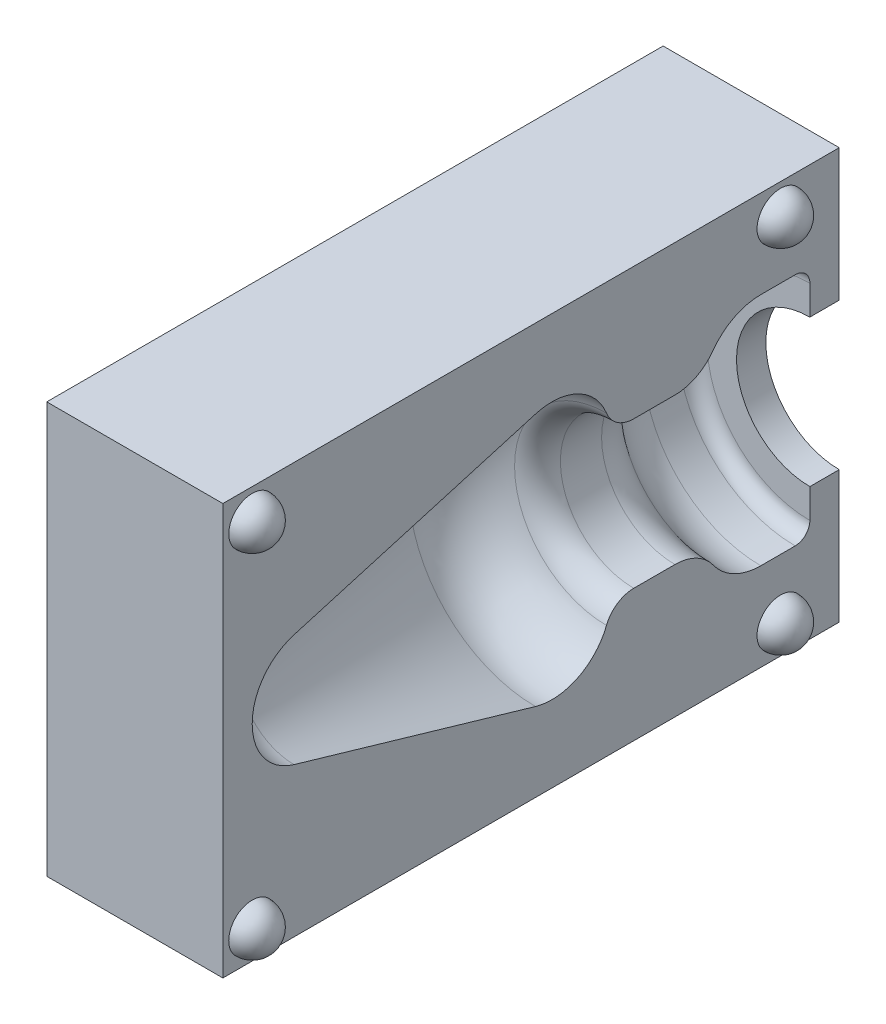
ISO-10303-21;
HEADER;
FILE_DESCRIPTION(('STEP AP214'),'2;1');
FILE_NAME('part.step','',(''),(''),'','','');
FILE_SCHEMA(('AUTOMOTIVE_DESIGN { 1 0 10303 214 1 1 1 1 }'));
ENDSEC;
DATA;
#1=APPLICATION_CONTEXT('core data for automotive mechanical design processes');
#2=APPLICATION_PROTOCOL_DEFINITION('international standard','automotive_design',2000,#1);
#3=PRODUCT_CONTEXT('',#1,'mechanical');
#4=PRODUCT('Part','Part','',(#3));
#5=PRODUCT_RELATED_PRODUCT_CATEGORY('part','',(#4));
#6=PRODUCT_DEFINITION_FORMATION('','',#4);
#7=PRODUCT_DEFINITION_CONTEXT('part definition',#1,'design');
#8=PRODUCT_DEFINITION('design','',#6,#7);
#9=PRODUCT_DEFINITION_SHAPE('','',#8);
#10=(LENGTH_UNIT() NAMED_UNIT(*) SI_UNIT(.MILLI.,.METRE.));
#11=(NAMED_UNIT(*) PLANE_ANGLE_UNIT() SI_UNIT($,.RADIAN.));
#12=(NAMED_UNIT(*) SI_UNIT($,.STERADIAN.) SOLID_ANGLE_UNIT());
#13=UNCERTAINTY_MEASURE_WITH_UNIT(LENGTH_MEASURE(1.E-05),#10,'distance_accuracy_value','');
#14=(GEOMETRIC_REPRESENTATION_CONTEXT(3) GLOBAL_UNCERTAINTY_ASSIGNED_CONTEXT((#13)) GLOBAL_UNIT_ASSIGNED_CONTEXT((#10,
#11,#12)) REPRESENTATION_CONTEXT('',''));
#15=CARTESIAN_POINT('',(0.,0.,0.));
#16=DIRECTION('',(0.,0.,1.));
#17=DIRECTION('',(1.,0.,0.));
#18=AXIS2_PLACEMENT_3D('',#15,#16,#17);
#19=CARTESIAN_POINT('',(0.,0.,95.));
#20=DIRECTION('',(0.,0.,-1.));
#21=DIRECTION('',(-1.,0.,0.));
#22=AXIS2_PLACEMENT_3D('',#19,#20,#21);
#23=PLANE('',#22);
#24=DIRECTION('',(0.,1.,0.));
#25=VECTOR('',#24,1.);
#26=CARTESIAN_POINT('',(0.,0.,95.));
#27=LINE('',#26,#25);
#28=CARTESIAN_POINT('',(0.,0.0750000000018305,95.));
#29=VERTEX_POINT('',#28);
#30=CARTESIAN_POINT('',(0.,-0.0750000000004563,95.));
#31=VERTEX_POINT('',#30);
#32=EDGE_CURVE('E117',#29,#31,#27,.F.);
#33=ORIENTED_EDGE('',*,*,#32,.T.);
#34=CARTESIAN_POINT('',(0.,0.,95.));
#35=DIRECTION('',(1.85037170770862E-13,1.85037170770862E-13,-1.));
#36=DIRECTION('',(-1.,0.,-1.85037170770862E-13));
#37=AXIS2_PLACEMENT_3D('',#34,#35,#36);
#38=CIRCLE('',#37,0.0749999999999993);
#39=EDGE_CURVE('E21',#29,#31,#38,.F.);
#40=ORIENTED_EDGE('',*,*,#39,.F.);
#41=EDGE_LOOP('',(#33,#40));
#42=FACE_BOUND('',#41,.T.);
#43=ADVANCED_FACE('F17',(#42),#23,.T.);
#44=CARTESIAN_POINT('',(1.83188154315869E-12,1.83188154315866E-12,85.1));
#45=DIRECTION('',(1.85037170770862E-13,1.85037170770862E-13,-1.));
#46=DIRECTION('',(-1.,0.,-1.85037170770862E-13));
#47=AXIS2_PLACEMENT_3D('',#44,#45,#46);
#48=DEGENERATE_TOROIDAL_SURFACE('',#47,0.0750000000018299,9.90000000000001,.T.);
#49=CARTESIAN_POINT('',(1.82155187660393E-12,0.0750000000036617,85.1));
#50=DIRECTION('',(-1.,-1.37728887393477E-13,-1.85037170770887E-13));
#51=DIRECTION('',(-1.85037170770887E-13,0.,1.));
#52=AXIS2_PLACEMENT_3D('',#49,#50,#51);
#53=CIRCLE('',#52,9.90000000000001);
#54=CARTESIAN_POINT('',(0.,9.57900000000106,87.8719999999995));
#55=VERTEX_POINT('',#54);
#56=EDGE_CURVE('E122',#55,#29,#53,.F.);
#57=ORIENTED_EDGE('',*,*,#56,.T.);
#58=ORIENTED_EDGE('',*,*,#39,.T.);
#59=CARTESIAN_POINT('',(1.83189532043519E-12,-0.074999999999998,85.1));
#60=DIRECTION('',(1.,0.,1.85037170770862E-13));
#61=DIRECTION('',(1.85037170770862E-13,0.,-1.));
#62=AXIS2_PLACEMENT_3D('',#59,#60,#61);
#63=CIRCLE('',#62,9.90000000000001);
#64=CARTESIAN_POINT('',(6.60359069767611E-13,-9.57900000000001,87.872));
#65=VERTEX_POINT('',#64);
#66=EDGE_CURVE('E121',#31,#65,#63,.T.);
#67=ORIENTED_EDGE('',*,*,#66,.T.);
#68=CARTESIAN_POINT('',(0.,0.,87.872));
#69=DIRECTION('',(0.,0.,-1.));
#70=DIRECTION('',(-1.,0.,0.));
#71=AXIS2_PLACEMENT_3D('',#68,#69,#70);
#72=CIRCLE('',#71,9.579);
#73=EDGE_CURVE('E127',#65,#55,#72,.T.);
#74=ORIENTED_EDGE('',*,*,#73,.T.);
#75=EDGE_LOOP('',(#57,#58,#67,#74));
#76=FACE_BOUND('',#75,.T.);
#77=ADVANCED_FACE('F125',(#76),#48,.F.);
#78=CARTESIAN_POINT('',(0.,0.,46.7451428115925));
#79=DIRECTION('',(0.,0.,-1.));
#80=DIRECTION('',(-1.,0.,0.));
#81=AXIS2_PLACEMENT_3D('',#78,#79,#80);
#82=CONICAL_SURFACE('',#81,21.5743333466189,0.283794109208328);
#83=CARTESIAN_POINT('',(0.,0.,46.7451428115925));
#84=DIRECTION('',(0.,0.,-1.));
#85=DIRECTION('',(-1.,0.,0.));
#86=AXIS2_PLACEMENT_3D('',#83,#84,#85);
#87=CIRCLE('',#86,21.5743333466188);
#88=CARTESIAN_POINT('',(0.,-21.5743333466188,46.7451428115925));
#89=VERTEX_POINT('',#88);
#90=CARTESIAN_POINT('',(0.,21.5743333466188,46.7451428115925));
#91=VERTEX_POINT('',#90);
#92=EDGE_CURVE('E499',#89,#91,#87,.T.);
#93=ORIENTED_EDGE('',*,*,#92,.T.);
#94=DIRECTION('',(0.,-0.279999999999999,0.960000000000001));
#95=VECTOR('',#94,1.);
#96=CARTESIAN_POINT('',(0.,21.5743333466188,46.7451428115925));
#97=LINE('',#96,#95);
#98=EDGE_CURVE('E146',#91,#55,#97,.T.);
#99=ORIENTED_EDGE('',*,*,#98,.T.);
#100=ORIENTED_EDGE('',*,*,#73,.F.);
#101=DIRECTION('',(0.,-0.279999999999999,-0.960000000000001));
#102=VECTOR('',#101,1.);
#103=CARTESIAN_POINT('',(0.,-9.579,87.872));
#104=LINE('',#103,#102);
#105=EDGE_CURVE('E132',#65,#89,#104,.T.);
#106=ORIENTED_EDGE('',*,*,#105,.T.);
#107=EDGE_LOOP('',(#93,#99,#100,#106));
#108=FACE_BOUND('',#107,.T.);
#109=ADVANCED_FACE('F247',(#108),#82,.F.);
#110=CARTESIAN_POINT('',(0.,0.,43.9451428115925));
#111=DIRECTION('',(0.,0.,-1.));
#112=DIRECTION('',(-1.,0.,0.));
#113=AXIS2_PLACEMENT_3D('',#110,#111,#112);
#114=TOROIDAL_SURFACE('',#113,11.9743333466188,10.);
#115=CARTESIAN_POINT('',(0.,0.,34.6483809371975));
#116=DIRECTION('',(0.,0.,1.));
#117=DIRECTION('',(-1.,0.,0.));
#118=AXIS2_PLACEMENT_3D('',#115,#116,#117);
#119=CIRCLE('',#118,15.6581111155396);
#120=CARTESIAN_POINT('',(0.,15.6581111155396,34.6483809371975));
#121=VERTEX_POINT('',#120);
#122=CARTESIAN_POINT('',(0.,-15.6581111155396,34.6483809371975));
#123=VERTEX_POINT('',#122);
#124=EDGE_CURVE('E233',#121,#123,#119,.T.);
#125=ORIENTED_EDGE('',*,*,#124,.F.);
#126=CARTESIAN_POINT('',(0.,15.6581111155396,34.6483809371975));
#127=CARTESIAN_POINT('',(0.,15.9195968283825,34.7519603203659));
#128=CARTESIAN_POINT('',(0.,16.1766856918784,34.8666242387304));
#129=CARTESIAN_POINT('',(0.,16.680287629009,35.1171800705973));
#130=CARTESIAN_POINT('',(0.,16.9268012082155,35.2530709678586));
#131=CARTESIAN_POINT('',(0.,17.4073265189603,35.5450468849546));
#132=CARTESIAN_POINT('',(0.,17.641346936224,35.7011176097067));
#133=CARTESIAN_POINT('',(0.,18.095411747219,36.0324082136067));
#134=CARTESIAN_POINT('',(0.,18.3154563115301,36.2076278589646));
#135=CARTESIAN_POINT('',(0.,18.7401109929584,36.5760646212188));
#136=CARTESIAN_POINT('',(0.,18.9447135871878,36.7692904090625));
#137=CARTESIAN_POINT('',(0.,19.3369159398995,37.1722971959028));
#138=CARTESIAN_POINT('',(0.,19.5245153391076,37.3820785445399));
#139=CARTESIAN_POINT('',(0.,19.8813277852951,37.8166470176979));
#140=CARTESIAN_POINT('',(0.,20.0505454042209,38.0414303883333));
#141=CARTESIAN_POINT('',(0.,20.3694442508555,38.5044504515763));
#142=CARTESIAN_POINT('',(0.,20.5191256000658,38.7426870605012));
#143=CARTESIAN_POINT('',(0.,20.7978777158438,39.2309013825695));
#144=CARTESIAN_POINT('',(0.,20.9269501843811,39.4808781239536));
#145=CARTESIAN_POINT('',(0.,21.1635822458065,39.9908145299473));
#146=CARTESIAN_POINT('',(0.,21.2711418342081,40.250774196639));
#147=CARTESIAN_POINT('',(0.,21.4640249409851,40.7789418667299));
#148=CARTESIAN_POINT('',(0.,21.5493389459349,41.0471533444159));
#149=CARTESIAN_POINT('',(0.,21.697061752905,41.589803596011));
#150=CARTESIAN_POINT('',(0.,21.7594711894468,41.8642421971874));
#151=CARTESIAN_POINT('',(0.,21.8609700455238,42.4175414653477));
#152=CARTESIAN_POINT('',(0.,21.9000476740209,42.6964042952226));
#153=CARTESIAN_POINT('',(0.,21.9545544733446,43.256425858476));
#154=CARTESIAN_POINT('',(0.,21.9699842336994,43.5375845344447));
#155=CARTESIAN_POINT('',(0.,21.9770843989937,44.0998771222639));
#156=CARTESIAN_POINT('',(0.,21.968781796845,44.3810106988376));
#157=CARTESIAN_POINT('',(0.,21.9285391473477,44.9414737936074));
#158=CARTESIAN_POINT('',(0.,21.8966095235859,45.2208040525773));
#159=CARTESIAN_POINT('',(0.,21.8198629467652,45.7089580803511));
#160=CARTESIAN_POINT('',(0.,21.7799958093889,45.9185739965827));
#161=CARTESIAN_POINT('',(0.,21.6870305237953,46.3344672905062));
#162=CARTESIAN_POINT('',(0.,21.6339555507114,46.5407498489578));
#163=CARTESIAN_POINT('',(0.,21.5743333466188,46.7451428115925));
#164=B_SPLINE_CURVE_WITH_KNOTS('',3,(#126,#127,#128,#129,#130,#131,#132,#133,#134,#135,#136,
#137,#138,#139,#140,#141,#142,#143,#144,#145,#146,#147,#148,#149,#150,#151,#152,#153,#154,#155,
#156,#157,#158,#159,#160,#161,#162,#163),.UNSPECIFIED.,.F.,.F.,(4,2,2,2,2,2,2,2,2,2,2,2,2,2,2,2,
2,2,4),(0.,0.843502608802614,1.68696484730751,2.52983283034858,3.37269052393501,
4.21595621820343,5.05923972635237,5.90231300907248,6.74538104823216,7.58837942717383,
8.43137798192628,9.27473645978017,10.118071572445,10.9618325157312,11.8055724241862,
12.6483530547151,13.4907620953032,14.130464540875,14.7690523504703),.UNSPECIFIED.);
#165=EDGE_CURVE('E147',#121,#91,#164,.T.);
#166=ORIENTED_EDGE('',*,*,#165,.T.);
#167=ORIENTED_EDGE('',*,*,#92,.F.);
#168=CARTESIAN_POINT('',(0.,-21.5743333466188,46.7451428115925));
#169=CARTESIAN_POINT('',(0.,-21.6531133239588,46.4751480305155));
#170=CARTESIAN_POINT('',(0.,-21.7204443425734,46.2018185007522));
#171=CARTESIAN_POINT('',(0.,-21.8318571754244,45.6504744007199));
#172=CARTESIAN_POINT('',(0.,-21.8759401022207,45.3724600553046));
#173=CARTESIAN_POINT('',(0.,-21.9404903248421,44.8139013930407));
#174=CARTESIAN_POINT('',(0.,-21.960974237014,44.5333589966671));
#175=CARTESIAN_POINT('',(0.,-21.978246195864,43.9715494237211));
#176=CARTESIAN_POINT('',(0.,-21.9750345318102,43.6902822560385));
#177=CARTESIAN_POINT('',(0.,-21.9449290093063,43.1288814155028));
#178=CARTESIAN_POINT('',(0.,-21.9180236878094,42.8487483572459));
#179=CARTESIAN_POINT('',(0.,-21.8407063737951,42.2917392113017));
#180=CARTESIAN_POINT('',(0.,-21.7902938847142,42.0148631925426));
#181=CARTESIAN_POINT('',(0.,-21.6663358592682,41.4664114740251));
#182=CARTESIAN_POINT('',(0.,-21.5927960929636,41.1948344701367));
#183=CARTESIAN_POINT('',(0.,-21.4231028635258,40.658841689184));
#184=CARTESIAN_POINT('',(0.,-21.3269495410431,40.3944258675904));
#185=CARTESIAN_POINT('',(0.,-21.1127212249961,39.8746545766105));
#186=CARTESIAN_POINT('',(0.,-20.994648043411,39.6192983603993));
#187=CARTESIAN_POINT('',(0.,-20.7374138530614,39.1194379379137));
#188=CARTESIAN_POINT('',(0.,-20.5982528398989,38.8749337339026));
#189=CARTESIAN_POINT('',(0.,-20.2997681641159,38.3984131373572));
#190=CARTESIAN_POINT('',(0.,-20.1404359183036,38.1664021211371));
#191=CARTESIAN_POINT('',(0.,-19.8027932566294,37.7166368976339));
#192=CARTESIAN_POINT('',(0.,-19.6244833666787,37.498882295545));
#193=CARTESIAN_POINT('',(0.,-19.2500556874425,37.0790656558635));
#194=CARTESIAN_POINT('',(0.,-19.0539289517619,36.8770115975374));
#195=CARTESIAN_POINT('',(0.,-18.6453442063658,36.4901606594347));
#196=CARTESIAN_POINT('',(0.,-18.4328866039084,36.3053633495648));
#197=CARTESIAN_POINT('',(0.,-17.9934038426505,35.9545382232972));
#198=CARTESIAN_POINT('',(0.,-17.7663955208506,35.7884893060674));
#199=CARTESIAN_POINT('',(0.,-17.2992906420413,35.476157137327));
#200=CARTESIAN_POINT('',(0.,-17.0591998998891,35.3298652032276));
#201=CARTESIAN_POINT('',(0.,-16.6267600440294,35.0907414633993));
#202=CARTESIAN_POINT('',(0.,-16.4368246032374,34.9935162130198));
#203=CARTESIAN_POINT('',(0.,-16.0514657693444,34.8115592252542));
#204=CARTESIAN_POINT('',(0.,-15.8560525152647,34.7268060139926));
#205=CARTESIAN_POINT('',(0.,-15.6581111155396,34.6483809371975));
#206=B_SPLINE_CURVE_WITH_KNOTS('',3,(#168,#169,#170,#171,#172,#173,#174,#175,#176,#177,#178,
#179,#180,#181,#182,#183,#184,#185,#186,#187,#188,#189,#190,#191,#192,#193,#194,#195,#196,#197,
#198,#199,#200,#201,#202,#203,#204,#205),.UNSPECIFIED.,.F.,.F.,(4,2,2,2,2,2,2,2,2,2,2,2,2,2,2,2,
2,2,4),(0.,0.843502608802622,1.68696484730752,2.52983283034857,3.37269052393501,
4.21595621820343,5.05923972635237,5.90231300907249,6.74538104823216,7.58837942717382,
8.43137798192627,9.27473645978018,10.118071572445,10.9618325157312,11.8055724241862,
12.6483530547151,13.4907620953032,14.130464540875,14.7690523504703),.UNSPECIFIED.);
#207=EDGE_CURVE('E134',#89,#123,#206,.T.);
#208=ORIENTED_EDGE('',*,*,#207,.T.);
#209=EDGE_LOOP('',(#125,#166,#167,#208));
#210=FACE_BOUND('',#209,.T.);
#211=ADVANCED_FACE('F161',(#210),#114,.F.);
#212=CARTESIAN_POINT('',(0.,0.,30.));
#213=DIRECTION('',(0.,0.,1.));
#214=DIRECTION('',(-1.,0.,0.));
#215=AXIS2_PLACEMENT_3D('',#212,#213,#214);
#216=TOROIDAL_SURFACE('',#215,17.5,5.);
#217=CARTESIAN_POINT('',(0.,12.5,30.));
#218=CARTESIAN_POINT('',(0.,12.4999848789469,30.1406280260115));
#219=CARTESIAN_POINT('',(0.,12.5059322378173,30.2812538799012));
#220=CARTESIAN_POINT('',(0.,12.5296427162452,30.5614996473747));
#221=CARTESIAN_POINT('',(0.,12.5474052835465,30.7011196076666));
#222=CARTESIAN_POINT('',(0.,12.5946198890351,30.9782648916681));
#223=CARTESIAN_POINT('',(0.,12.6240634489387,31.1157916596455));
#224=CARTESIAN_POINT('',(0.,12.6944257910108,31.3878755313183));
#225=CARTESIAN_POINT('',(0.,12.7353444166466,31.5224326754958));
#226=CARTESIAN_POINT('',(0.,12.8283783503133,31.7876537255822));
#227=CARTESIAN_POINT('',(0.,12.8804962309564,31.9183167290909));
#228=CARTESIAN_POINT('',(0.,12.9955724137892,32.174833234794));
#229=CARTESIAN_POINT('',(0.,13.0585344819135,32.300685047558));
#230=CARTESIAN_POINT('',(0.,13.1948242963772,32.5466098000423));
#231=CARTESIAN_POINT('',(0.,13.2681498309163,32.6666839655337));
#232=CARTESIAN_POINT('',(0.,13.4246553676385,32.9002285118493));
#233=CARTESIAN_POINT('',(0.,13.5078353717113,33.0136988914072));
#234=CARTESIAN_POINT('',(0.,13.6835052122624,33.2332874324052));
#235=CARTESIAN_POINT('',(0.,13.7759999615649,33.339401663693));
#236=CARTESIAN_POINT('',(0.,13.9695703751536,33.5434211774498));
#237=CARTESIAN_POINT('',(0.,14.0706430535256,33.6413292930118));
#238=CARTESIAN_POINT('',(0.,14.2806435856645,33.8282497211688));
#239=CARTESIAN_POINT('',(0.,14.3895687662667,33.9172650366794));
#240=CARTESIAN_POINT('',(0.,14.6144899815324,34.0857774159718));
#241=CARTESIAN_POINT('',(0.,14.7304837083672,34.1652775615259));
#242=CARTESIAN_POINT('',(0.,14.9779448006042,34.3199676210708));
#243=CARTESIAN_POINT('',(0.,15.1099157816714,34.3943534082574));
#244=CARTESIAN_POINT('',(0.,15.3797915247996,34.5307381700344));
#245=CARTESIAN_POINT('',(0.,15.5176844205897,34.5927606284997));
#246=CARTESIAN_POINT('',(0.,15.6581111155396,34.6483809371975));
#247=B_SPLINE_CURVE_WITH_KNOTS('',3,(#217,#218,#219,#220,#221,#222,#223,#224,#225,#226,#227,
#228,#229,#230,#231,#232,#233,#234,#235,#236,#237,#238,#239,#240,#241,#242,#243,#244,#245,#246),
.UNSPECIFIED.,.F.,.F.,(4,2,2,2,2,2,2,2,2,2,2,2,2,2,4),(0.,0.42175530917628,0.843490906418767,
1.26492095843873,1.68634526195626,2.10786647571107,2.52953437025293,2.95111240675678,
3.3726905241036,3.79449216828968,4.21614758393561,4.63766013050088,5.05903578606103,
5.51287982887678,5.9658534133287),.UNSPECIFIED.);
#248=CARTESIAN_POINT('',(0.,12.5,30.));
#249=VERTEX_POINT('',#248);
#250=EDGE_CURVE('E154',#249,#121,#247,.T.);
#251=ORIENTED_EDGE('',*,*,#250,.T.);
#252=ORIENTED_EDGE('',*,*,#124,.T.);
#253=CARTESIAN_POINT('',(0.,-15.6581111155396,34.6483809371975));
#254=CARTESIAN_POINT('',(0.,-15.5273670182102,34.5965907552897));
#255=CARTESIAN_POINT('',(0.,-15.3988213853495,34.5392581979403));
#256=CARTESIAN_POINT('',(0.,-15.1470179820311,34.4139788179478));
#257=CARTESIAN_POINT('',(0.,-15.0237599647109,34.3460324915178));
#258=CARTESIAN_POINT('',(0.,-14.7834974051202,34.2000440334991));
#259=CARTESIAN_POINT('',(0.,-14.6664883969372,34.1220092519327));
#260=CARTESIAN_POINT('',(0.,-14.4394584236061,33.9563654062407));
#261=CARTESIAN_POINT('',(0.,-14.3294373631595,33.8687564727273));
#262=CARTESIAN_POINT('',(0.,-14.1171393021462,33.6845634991578));
#263=CARTESIAN_POINT('',(0.,-14.0148640882124,33.5879773998295));
#264=CARTESIAN_POINT('',(0.,-13.8187783095803,33.3864988328014));
#265=CARTESIAN_POINT('',(0.,-13.7249707027917,33.2816034863504));
#266=CARTESIAN_POINT('',(0.,-13.5465464553702,33.06430487765));
#267=CARTESIAN_POINT('',(0.,-13.4619278603892,32.9519032201119));
#268=CARTESIAN_POINT('',(0.,-13.3024602186622,32.7203711286418));
#269=CARTESIAN_POINT('',(0.,-13.2276111737897,32.6012406934196));
#270=CARTESIAN_POINT('',(0.,-13.0881778015185,32.357033087244));
#271=CARTESIAN_POINT('',(0.,-13.023598937664,32.231952796736));
#272=CARTESIAN_POINT('',(0.,-12.9052338925813,31.9768387377094));
#273=CARTESIAN_POINT('',(0.,-12.8514439775493,31.8468067014758));
#274=CARTESIAN_POINT('',(0.,-12.7550280357212,31.5827168756164));
#275=CARTESIAN_POINT('',(0.,-12.7123982324514,31.4486604649609));
#276=CARTESIAN_POINT('',(0.,-12.63859226339,31.1774803514158));
#277=CARTESIAN_POINT('',(0.,-12.6074123823952,31.0403576588034));
#278=CARTESIAN_POINT('',(0.,-12.5547598846283,30.7533145937904));
#279=CARTESIAN_POINT('',(0.,-12.5342203662168,30.6032222443431));
#280=CARTESIAN_POINT('',(0.,-12.5068429271537,30.3020840770439));
#281=CARTESIAN_POINT('',(0.,-12.4999788028324,30.1510406400439));
#282=CARTESIAN_POINT('',(0.,-12.5,30.));
#283=B_SPLINE_CURVE_WITH_KNOTS('',3,(#253,#254,#255,#256,#257,#258,#259,#260,#261,#262,#263,
#264,#265,#266,#267,#268,#269,#270,#271,#272,#273,#274,#275,#276,#277,#278,#279,#280,#281,#282),
.UNSPECIFIED.,.F.,.F.,(4,2,2,2,2,2,2,2,2,2,2,2,2,2,4),(0.,0.421755309176284,0.843490906418768,
1.26492095843874,1.68634526195627,2.10786647571107,2.52953437025293,2.95111240675679,
3.37269052410361,3.79449216828969,4.21614758393562,4.63766013050088,5.05903578606103,
5.51287982887678,5.9658534133287),.UNSPECIFIED.);
#284=CARTESIAN_POINT('',(0.,-12.5,30.));
#285=VERTEX_POINT('',#284);
#286=EDGE_CURVE('E196',#123,#285,#283,.T.);
#287=ORIENTED_EDGE('',*,*,#286,.T.);
#288=CARTESIAN_POINT('',(0.,0.,30.));
#289=DIRECTION('',(0.,0.,1.));
#290=DIRECTION('',(1.,0.,0.));
#291=AXIS2_PLACEMENT_3D('',#288,#289,#290);
#292=CIRCLE('',#291,12.5);
#293=EDGE_CURVE('E231',#285,#249,#292,.F.);
#294=ORIENTED_EDGE('',*,*,#293,.T.);
#295=EDGE_LOOP('',(#251,#252,#287,#294));
#296=FACE_BOUND('',#295,.T.);
#297=ADVANCED_FACE('F236',(#296),#216,.T.);
#298=CARTESIAN_POINT('',(0.,0.,15.));
#299=DIRECTION('',(0.,0.,1.));
#300=DIRECTION('',(1.,0.,0.));
#301=AXIS2_PLACEMENT_3D('',#298,#299,#300);
#302=CYLINDRICAL_SURFACE('',#301,12.5);
#303=CARTESIAN_POINT('',(0.,0.,22.9843597113357));
#304=DIRECTION('',(0.,0.,-1.));
#305=DIRECTION('',(-1.,0.,0.));
#306=AXIS2_PLACEMENT_3D('',#303,#304,#305);
#307=CIRCLE('',#306,12.5);
#308=CARTESIAN_POINT('',(0.,12.5,22.9843597113357));
#309=VERTEX_POINT('',#308);
#310=CARTESIAN_POINT('',(0.,-12.5,22.9843597113357));
#311=VERTEX_POINT('',#310);
#312=EDGE_CURVE('E228',#309,#311,#307,.F.);
#313=ORIENTED_EDGE('',*,*,#312,.F.);
#314=DIRECTION('',(0.,0.,1.));
#315=VECTOR('',#314,1.);
#316=CARTESIAN_POINT('',(0.,12.5,47.5));
#317=LINE('',#316,#315);
#318=EDGE_CURVE('E210',#309,#249,#317,.T.);
#319=ORIENTED_EDGE('',*,*,#318,.T.);
#320=ORIENTED_EDGE('',*,*,#293,.F.);
#321=DIRECTION('',(0.,0.,1.));
#322=VECTOR('',#321,1.);
#323=CARTESIAN_POINT('',(0.,-12.5,47.5));
#324=LINE('',#323,#322);
#325=EDGE_CURVE('E424',#285,#311,#324,.F.);
#326=ORIENTED_EDGE('',*,*,#325,.T.);
#327=EDGE_LOOP('',(#313,#319,#320,#326));
#328=FACE_BOUND('',#327,.T.);
#329=ADVANCED_FACE('F219',(#328),#302,.F.);
#330=CARTESIAN_POINT('',(0.,0.,22.9843597113357));
#331=DIRECTION('',(0.,0.,-1.));
#332=DIRECTION('',(-1.,0.,0.));
#333=AXIS2_PLACEMENT_3D('',#330,#331,#332);
#334=TOROIDAL_SURFACE('',#333,20.5,8.);
#335=CARTESIAN_POINT('',(0.,15.8333333333333,16.4864968147964));
#336=CARTESIAN_POINT('',(0.,15.6505363473192,16.6177490267966));
#337=CARTESIAN_POINT('',(0.,15.473308772315,16.7567501768618));
#338=CARTESIAN_POINT('',(0.,15.1311913280324,17.0491742609203));
#339=CARTESIAN_POINT('',(0.,14.9663009824314,17.2025966376145));
#340=CARTESIAN_POINT('',(0.,14.6502042049924,17.5226337425984));
#341=CARTESIAN_POINT('',(0.,14.4989839584928,17.6892348261076));
#342=CARTESIAN_POINT('',(0.,14.2111102707254,18.0345728768037));
#343=CARTESIAN_POINT('',(0.,14.0744564921971,18.2133095628556));
#344=CARTESIAN_POINT('',(0.,13.8165844517793,18.5817959317664));
#345=CARTESIAN_POINT('',(0.,13.6953781381041,18.7715539761994));
#346=CARTESIAN_POINT('',(0.,13.4693840855021,19.1606117279551));
#347=CARTESIAN_POINT('',(0.,13.3645965766925,19.3599115689592));
#348=CARTESIAN_POINT('',(0.,13.1722279586232,19.7665454001583));
#349=CARTESIAN_POINT('',(0.,13.0846397939735,19.9738760540483));
#350=CARTESIAN_POINT('',(0.,12.9272466897319,20.3951600538228));
#351=CARTESIAN_POINT('',(0.,12.8574392619383,20.6091124683663));
#352=CARTESIAN_POINT('',(0.,12.7476106883996,21.0010146005929));
#353=CARTESIAN_POINT('',(0.,12.7044510254641,21.1780925837795));
#354=CARTESIAN_POINT('',(0.,12.6303185746371,21.5347772541328));
#355=CARTESIAN_POINT('',(0.,12.5993449986897,21.7143837770043));
#356=CARTESIAN_POINT('',(0.,12.5497334199464,22.0752796521917));
#357=CARTESIAN_POINT('',(0.,12.5310946871083,22.2565689042706));
#358=CARTESIAN_POINT('',(0.,12.5062219276056,22.6200245387899));
#359=CARTESIAN_POINT('',(0.,12.4999898310241,22.8021910532867));
#360=CARTESIAN_POINT('',(0.,12.5,22.9843597113357));
#361=B_SPLINE_CURVE_WITH_KNOTS('',3,(#335,#336,#337,#338,#339,#340,#341,#342,#343,#344,#345,
#346,#347,#348,#349,#350,#351,#352,#353,#354,#355,#356,#357,#358,#359,#360),.UNSPECIFIED.,.F.,
.F.,(4,2,2,2,2,2,2,2,2,2,2,2,4),(0.,0.674906473542297,1.34978687645972,2.02397745416592,
2.69815241880583,3.37284571584841,4.04754846818561,4.72197386800985,5.39630483813788,
5.94268335445204,6.48902653147419,7.03533737008725,7.58173319088161),.UNSPECIFIED.);
#362=CARTESIAN_POINT('',(0.,15.8333333333333,16.4864968147963));
#363=VERTEX_POINT('',#362);
#364=EDGE_CURVE('E203',#363,#309,#361,.T.);
#365=ORIENTED_EDGE('',*,*,#364,.T.);
#366=ORIENTED_EDGE('',*,*,#312,.T.);
#367=CARTESIAN_POINT('',(0.,-12.5,22.9843597113357));
#368=CARTESIAN_POINT('',(0.,-12.4999757846307,22.7593222018747));
#369=CARTESIAN_POINT('',(0.,-12.509494334493,22.5342881371871));
#370=CARTESIAN_POINT('',(0.,-12.5474422760605,22.0858283905534));
#371=CARTESIAN_POINT('',(0.,-12.5758709372541,21.8624026468137));
#372=CARTESIAN_POINT('',(0.,-12.6514258041635,21.4189701453435));
#373=CARTESIAN_POINT('',(0.,-12.6985328685876,21.1989601263463));
#374=CARTESIAN_POINT('',(0.,-12.8111014640209,20.7636924607776));
#375=CARTESIAN_POINT('',(0.,-12.8765625699478,20.5484347042676));
#376=CARTESIAN_POINT('',(0.,-13.0254339510907,20.1240321769673));
#377=CARTESIAN_POINT('',(0.,-13.1088579876437,19.9148922333243));
#378=CARTESIAN_POINT('',(0.,-13.2930336148438,19.5043820819784));
#379=CARTESIAN_POINT('',(0.,-13.3937854483066,19.3030119832033));
#380=CARTESIAN_POINT('',(0.,-13.6118517816278,18.9095608017775));
#381=CARTESIAN_POINT('',(0.,-13.7291594559854,18.7174759346849));
#382=CARTESIAN_POINT('',(0.,-13.9795275207246,18.3438870832887));
#383=CARTESIAN_POINT('',(0.,-14.1125857031893,18.1623816212679));
#384=CARTESIAN_POINT('',(0.,-14.3668348258004,17.8445656675136));
#385=CARTESIAN_POINT('',(0.,-14.4854869128475,17.7062144807695));
#386=CARTESIAN_POINT('',(0.,-14.731953993855,17.4379356103562));
#387=CARTESIAN_POINT('',(0.,-14.8597683946703,17.3080073824409));
#388=CARTESIAN_POINT('',(0.,-15.1239597966818,17.0571886339871));
#389=CARTESIAN_POINT('',(0.,-15.2603362906044,16.9362975789561));
#390=CARTESIAN_POINT('',(0.,-15.5410377911546,16.7040793195148));
#391=CARTESIAN_POINT('',(0.,-15.6853640309247,16.5927536057485));
#392=CARTESIAN_POINT('',(0.,-15.8333333333334,16.4864968147964));
#393=B_SPLINE_CURVE_WITH_KNOTS('',3,(#367,#368,#369,#370,#371,#372,#373,#374,#375,#376,#377,
#378,#379,#380,#381,#382,#383,#384,#385,#386,#387,#388,#389,#390,#391,#392),.UNSPECIFIED.,.F.,
.F.,(4,2,2,2,2,2,2,2,2,2,2,2,4),(0.,0.674906473542293,1.34978687645972,2.02397745416592,
2.69815241880583,3.3728457158484,4.0475484681856,4.72197386800984,5.39630483813787,
5.94268335445204,6.4890265314742,7.03533737008726,7.58173319088162),.UNSPECIFIED.);
#394=CARTESIAN_POINT('',(0.,-15.8333333333333,16.4864968147963));
#395=VERTEX_POINT('',#394);
#396=EDGE_CURVE('E189',#311,#395,#393,.T.);
#397=ORIENTED_EDGE('',*,*,#396,.T.);
#398=CARTESIAN_POINT('',(0.,0.,16.4864968147963));
#399=DIRECTION('',(0.,0.,1.));
#400=DIRECTION('',(0.,1.,0.));
#401=AXIS2_PLACEMENT_3D('',#398,#399,#400);
#402=CIRCLE('',#401,15.8333333333333);
#403=EDGE_CURVE('E226',#363,#395,#402,.T.);
#404=ORIENTED_EDGE('',*,*,#403,.F.);
#405=EDGE_LOOP('',(#365,#366,#397,#404));
#406=FACE_BOUND('',#405,.T.);
#407=ADVANCED_FACE('F213',(#406),#334,.T.);
#408=CARTESIAN_POINT('',(0.,0.,8.36416819412221));
#409=DIRECTION('',(0.,0.,1.));
#410=DIRECTION('',(1.,0.,0.));
#411=AXIS2_PLACEMENT_3D('',#408,#409,#410);
#412=TOROIDAL_SURFACE('',#411,10.0000000000002,9.99999999999983);
#413=CARTESIAN_POINT('',(0.,10.0000000000002,8.36416819412221));
#414=DIRECTION('',(1.,0.,0.));
#415=DIRECTION('',(0.,1.,0.));
#416=AXIS2_PLACEMENT_3D('',#413,#414,#415);
#417=CIRCLE('',#416,9.99999999999983);
#418=CARTESIAN_POINT('',(0.,20.,8.36416819412221));
#419=VERTEX_POINT('',#418);
#420=EDGE_CURVE('E211',#419,#363,#417,.T.);
#421=ORIENTED_EDGE('',*,*,#420,.T.);
#422=ORIENTED_EDGE('',*,*,#403,.T.);
#423=CARTESIAN_POINT('',(0.,-10.0000000000002,8.36416819412221));
#424=DIRECTION('',(-1.,0.,0.));
#425=DIRECTION('',(0.,-1.,0.));
#426=AXIS2_PLACEMENT_3D('',#423,#424,#425);
#427=CIRCLE('',#426,9.99999999999983);
#428=CARTESIAN_POINT('',(0.,-20.,8.36416819412221));
#429=VERTEX_POINT('',#428);
#430=EDGE_CURVE('E414',#395,#429,#427,.F.);
#431=ORIENTED_EDGE('',*,*,#430,.T.);
#432=CARTESIAN_POINT('',(0.,0.,8.36416819412221));
#433=DIRECTION('',(0.,0.,1.));
#434=DIRECTION('',(1.,0.,0.));
#435=AXIS2_PLACEMENT_3D('',#432,#433,#434);
#436=CIRCLE('',#435,20.);
#437=EDGE_CURVE('E404',#429,#419,#436,.F.);
#438=ORIENTED_EDGE('',*,*,#437,.T.);
#439=EDGE_LOOP('',(#421,#422,#431,#438));
#440=FACE_BOUND('',#439,.T.);
#441=ADVANCED_FACE('F19',(#440),#412,.F.);
#442=CARTESIAN_POINT('',(0.,0.,0.));
#443=DIRECTION('',(0.,0.,1.));
#444=DIRECTION('',(1.,0.,0.));
#445=AXIS2_PLACEMENT_3D('',#442,#443,#444);
#446=CYLINDRICAL_SURFACE('',#445,20.);
#447=CARTESIAN_POINT('',(0.,0.,2.5));
#448=DIRECTION('',(0.,0.,1.));
#449=DIRECTION('',(-1.,0.,0.));
#450=AXIS2_PLACEMENT_3D('',#447,#448,#449);
#451=CIRCLE('',#450,20.);
#452=CARTESIAN_POINT('',(0.,-20.,2.5));
#453=VERTEX_POINT('',#452);
#454=CARTESIAN_POINT('',(0.,20.,2.5));
#455=VERTEX_POINT('',#454);
#456=EDGE_CURVE('E403',#453,#455,#451,.F.);
#457=ORIENTED_EDGE('',*,*,#456,.T.);
#458=DIRECTION('',(0.,0.,1.));
#459=VECTOR('',#458,1.);
#460=CARTESIAN_POINT('',(0.,20.,47.5));
#461=LINE('',#460,#459);
#462=EDGE_CURVE('E433',#455,#419,#461,.T.);
#463=ORIENTED_EDGE('',*,*,#462,.T.);
#464=ORIENTED_EDGE('',*,*,#437,.F.);
#465=DIRECTION('',(0.,0.,1.));
#466=VECTOR('',#465,1.);
#467=CARTESIAN_POINT('',(0.,-20.,47.5));
#468=LINE('',#467,#466);
#469=EDGE_CURVE('E421',#429,#453,#468,.F.);
#470=ORIENTED_EDGE('',*,*,#469,.T.);
#471=EDGE_LOOP('',(#457,#463,#464,#470));
#472=FACE_BOUND('',#471,.T.);
#473=ADVANCED_FACE('F221',(#472),#446,.F.);
#474=CARTESIAN_POINT('',(0.,0.,2.5));
#475=DIRECTION('',(0.,0.,1.));
#476=DIRECTION('',(-1.,0.,0.));
#477=AXIS2_PLACEMENT_3D('',#474,#475,#476);
#478=TOROIDAL_SURFACE('',#477,17.5,2.5);
#479=CARTESIAN_POINT('',(0.,0.,0.));
#480=DIRECTION('',(0.,0.,-1.));
#481=DIRECTION('',(0.,-1.,0.));
#482=AXIS2_PLACEMENT_3D('',#479,#480,#481);
#483=CIRCLE('',#482,17.5);
#484=CARTESIAN_POINT('',(0.,17.5,0.));
#485=VERTEX_POINT('',#484);
#486=CARTESIAN_POINT('',(0.,-17.5,0.));
#487=VERTEX_POINT('',#486);
#488=EDGE_CURVE('E368',#485,#487,#483,.F.);
#489=ORIENTED_EDGE('',*,*,#488,.F.);
#490=CARTESIAN_POINT('',(0.,17.5,0.));
#491=CARTESIAN_POINT('',(0.,17.5703165529183,-6.73760312874608E-06));
#492=CARTESIAN_POINT('',(0.,17.6406299123009,0.00296662635220174));
#493=CARTESIAN_POINT('',(0.,17.7807535505256,0.0148214172899862));
#494=CARTESIAN_POINT('',(0.,17.8505638533379,0.023702560865375));
#495=CARTESIAN_POINT('',(0.,17.9891391507902,0.0473118570983038));
#496=CARTESIAN_POINT('',(0.,18.0579048954248,0.0620355865817941));
#497=CARTESIAN_POINT('',(0.,18.1939348460155,0.097210622779923));
#498=CARTESIAN_POINT('',(0.,18.2611990702902,0.11766185957779));
#499=CARTESIAN_POINT('',(0.,18.4600904524064,0.187441620520704));
#500=CARTESIAN_POINT('',(0.,18.5888727124231,0.245205854231468));
#501=CARTESIAN_POINT('',(0.,18.834816841989,0.381496884635308));
#502=CARTESIAN_POINT('',(0.,18.9519807536233,0.460020023738258));
#503=CARTESIAN_POINT('',(0.,19.1714822376988,0.635626131888733));
#504=CARTESIAN_POINT('',(0.,19.273819954816,0.732708919807164));
#505=CARTESIAN_POINT('',(0.,19.4607594105526,0.94269832841828));
#506=CARTESIAN_POINT('',(0.,19.5453576756194,1.05560804096441));
#507=CARTESIAN_POINT('',(0.,19.6944101921718,1.29403944841449));
#508=CARTESIAN_POINT('',(0.,19.7588604999399,1.41956360609659));
#509=CARTESIAN_POINT('',(0.,19.8657388405433,1.67962578574635));
#510=CARTESIAN_POINT('',(0.,19.9081797717814,1.81415847602264));
#511=CARTESIAN_POINT('',(0.,19.9592878258857,2.04126203816156));
#512=CARTESIAN_POINT('',(0.,19.9745456682455,2.13240425694571));
#513=CARTESIAN_POINT('',(0.,19.9949004201684,2.31568491596665));
#514=CARTESIAN_POINT('',(0.,20.0000117346551,2.40782175690097));
#515=CARTESIAN_POINT('',(0.,20.,2.49999999999996));
#516=B_SPLINE_CURVE_WITH_KNOTS('',3,(#490,#491,#492,#493,#494,#495,#496,#497,#498,#499,#500,
#501,#502,#503,#504,#505,#506,#507,#508,#509,#510,#511,#512,#513,#514,#515),.UNSPECIFIED.,.F.,
.F.,(4,2,2,2,2,2,2,2,2,2,2,2,4),(0.,0.210881056383553,0.421751997144057,0.632463600098867,
0.843172630969151,1.26442121260169,1.68559562226152,2.1067659217657,2.52801861354842,
2.94935370886886,3.37044160460489,3.64714723687037,3.92345975118444),.UNSPECIFIED.);
#517=EDGE_CURVE('E398',#485,#455,#516,.T.);
#518=ORIENTED_EDGE('',*,*,#517,.T.);
#519=ORIENTED_EDGE('',*,*,#456,.F.);
#520=CARTESIAN_POINT('',(0.,-20.,2.5));
#521=CARTESIAN_POINT('',(0.,-20.0000067376031,2.42968344708168));
#522=CARTESIAN_POINT('',(0.,-19.9970333736478,2.35937008769911));
#523=CARTESIAN_POINT('',(0.,-19.98517858271,2.21924644947442));
#524=CARTESIAN_POINT('',(0.,-19.9762974391346,2.14943614666213));
#525=CARTESIAN_POINT('',(0.,-19.9526881429017,2.01086084920981));
#526=CARTESIAN_POINT('',(0.,-19.9379644134182,1.94209510457522));
#527=CARTESIAN_POINT('',(0.,-19.9027893772201,1.80606515398446));
#528=CARTESIAN_POINT('',(0.,-19.8823381404222,1.73880092970978));
#529=CARTESIAN_POINT('',(0.,-19.8125583794793,1.53990954759356));
#530=CARTESIAN_POINT('',(0.,-19.7547941457685,1.41112728757694));
#531=CARTESIAN_POINT('',(0.,-19.6185031153647,1.165183158011));
#532=CARTESIAN_POINT('',(0.,-19.5399799762617,1.04801924637673));
#533=CARTESIAN_POINT('',(0.,-19.3643738681113,0.82851776230125));
#534=CARTESIAN_POINT('',(0.,-19.2672910801928,0.726180045183965));
#535=CARTESIAN_POINT('',(0.,-19.0573016715817,0.539240589447368));
#536=CARTESIAN_POINT('',(0.,-18.9443919590356,0.454642324380624));
#537=CARTESIAN_POINT('',(0.,-18.7059605515855,0.305589807828165));
#538=CARTESIAN_POINT('',(0.,-18.5804363939034,0.241139500060057));
#539=CARTESIAN_POINT('',(0.,-18.3203742142537,0.134261159456687));
#540=CARTESIAN_POINT('',(0.,-18.1858415239774,0.0918202282186389));
#541=CARTESIAN_POINT('',(0.,-17.9587379618384,0.0407121741143466));
#542=CARTESIAN_POINT('',(0.,-17.8675957430543,0.0254543317545226));
#543=CARTESIAN_POINT('',(0.,-17.6843150840334,0.00509957983161923));
#544=CARTESIAN_POINT('',(0.,-17.592178243099,-1.1734655053687E-05));
#545=CARTESIAN_POINT('',(0.,-17.5,0.));
#546=B_SPLINE_CURVE_WITH_KNOTS('',3,(#520,#521,#522,#523,#524,#525,#526,#527,#528,#529,#530,
#531,#532,#533,#534,#535,#536,#537,#538,#539,#540,#541,#542,#543,#544,#545),.UNSPECIFIED.,.F.,
.F.,(4,2,2,2,2,2,2,2,2,2,2,2,4),(0.,0.210881056383553,0.421751997144058,0.63246360009887,
0.843172630969149,1.26442121260169,1.68559562226151,2.1067659217657,2.52801861354842,
2.94935370886885,3.37044160460489,3.64714723687037,3.92345975118444),.UNSPECIFIED.);
#547=EDGE_CURVE('E422',#453,#487,#546,.T.);
#548=ORIENTED_EDGE('',*,*,#547,.T.);
#549=EDGE_LOOP('',(#489,#518,#519,#548));
#550=FACE_BOUND('',#549,.T.);
#551=ADVANCED_FACE('F382',(#550),#478,.F.);
#552=CARTESIAN_POINT('',(0.,0.,0.));
#553=DIRECTION('',(0.,0.,1.));
#554=DIRECTION('',(1.,0.,0.));
#555=AXIS2_PLACEMENT_3D('',#552,#553,#554);
#556=PLANE('',#555);
#557=ORIENTED_EDGE('',*,*,#488,.T.);
#558=DIRECTION('',(0.,1.,0.));
#559=VECTOR('',#558,1.);
#560=CARTESIAN_POINT('',(0.,0.,0.));
#561=LINE('',#560,#559);
#562=CARTESIAN_POINT('',(0.,-12.5,0.));
#563=VERTEX_POINT('',#562);
#564=EDGE_CURVE('E321',#487,#563,#561,.T.);
#565=ORIENTED_EDGE('',*,*,#564,.T.);
#566=CARTESIAN_POINT('',(0.,0.,0.));
#567=DIRECTION('',(0.,0.,1.));
#568=DIRECTION('',(1.,0.,0.));
#569=AXIS2_PLACEMENT_3D('',#566,#567,#568);
#570=CIRCLE('',#569,12.5);
#571=CARTESIAN_POINT('',(0.,12.5,0.));
#572=VERTEX_POINT('',#571);
#573=EDGE_CURVE('E399',#563,#572,#570,.F.);
#574=ORIENTED_EDGE('',*,*,#573,.T.);
#575=DIRECTION('',(0.,1.,0.));
#576=VECTOR('',#575,1.);
#577=CARTESIAN_POINT('',(0.,0.,0.));
#578=LINE('',#577,#576);
#579=EDGE_CURVE('E402',#572,#485,#578,.T.);
#580=ORIENTED_EDGE('',*,*,#579,.T.);
#581=EDGE_LOOP('',(#557,#565,#574,#580));
#582=FACE_BOUND('',#581,.T.);
#583=ADVANCED_FACE('F374',(#582),#556,.T.);
#584=CARTESIAN_POINT('',(0.,-30.,95.));
#585=DIRECTION('',(0.,-1.,0.));
#586=DIRECTION('',(0.,0.,-1.));
#587=AXIS2_PLACEMENT_3D('',#584,#585,#586);
#588=SPHERICAL_SURFACE('',#587,4.);
#589=CARTESIAN_POINT('',(0.,-30.,95.));
#590=DIRECTION('',(1.,0.,0.));
#591=DIRECTION('',(0.,-1.,0.));
#592=AXIS2_PLACEMENT_3D('',#589,#590,#591);
#593=CIRCLE('',#592,4.);
#594=CARTESIAN_POINT('',(0.,-34.,95.));
#595=VERTEX_POINT('',#594);
#596=CARTESIAN_POINT('',(0.,-26.,95.));
#597=VERTEX_POINT('',#596);
#598=EDGE_CURVE('E320',#595,#597,#593,.T.);
#599=ORIENTED_EDGE('',*,*,#598,.T.);
#600=CARTESIAN_POINT('',(0.,-30.,95.));
#601=DIRECTION('',(-1.,0.,0.));
#602=DIRECTION('',(0.,-1.,0.));
#603=AXIS2_PLACEMENT_3D('',#600,#601,#602);
#604=CIRCLE('',#603,4.);
#605=EDGE_CURVE('E35',#597,#595,#604,.F.);
#606=ORIENTED_EDGE('',*,*,#605,.T.);
#607=EDGE_LOOP('',(#599,#606));
#608=FACE_BOUND('',#607,.T.);
#609=ADVANCED_FACE('F356',(#608),#588,.T.);
#610=CARTESIAN_POINT('',(0.,-30.,5.));
#611=DIRECTION('',(0.,-1.,0.));
#612=DIRECTION('',(0.,0.,-1.));
#613=AXIS2_PLACEMENT_3D('',#610,#611,#612);
#614=SPHERICAL_SURFACE('',#613,4.);
#615=CARTESIAN_POINT('',(0.,-30.,5.));
#616=DIRECTION('',(1.,0.,0.));
#617=DIRECTION('',(0.,-1.,0.));
#618=AXIS2_PLACEMENT_3D('',#615,#616,#617);
#619=CIRCLE('',#618,4.);
#620=CARTESIAN_POINT('',(0.,-34.,5.));
#621=VERTEX_POINT('',#620);
#622=CARTESIAN_POINT('',(0.,-26.,5.));
#623=VERTEX_POINT('',#622);
#624=EDGE_CURVE('E623',#621,#623,#619,.T.);
#625=ORIENTED_EDGE('',*,*,#624,.T.);
#626=CARTESIAN_POINT('',(0.,-30.,5.));
#627=DIRECTION('',(-1.,0.,0.));
#628=DIRECTION('',(0.,-1.,0.));
#629=AXIS2_PLACEMENT_3D('',#626,#627,#628);
#630=CIRCLE('',#629,4.);
#631=EDGE_CURVE('E625',#623,#621,#630,.F.);
#632=ORIENTED_EDGE('',*,*,#631,.T.);
#633=EDGE_LOOP('',(#625,#632));
#634=FACE_BOUND('',#633,.T.);
#635=ADVANCED_FACE('F352',(#634),#614,.T.);
#636=CARTESIAN_POINT('',(0.,30.,95.));
#637=DIRECTION('',(0.,-1.,0.));
#638=DIRECTION('',(0.,0.,-1.));
#639=AXIS2_PLACEMENT_3D('',#636,#637,#638);
#640=SPHERICAL_SURFACE('',#639,4.);
#641=CARTESIAN_POINT('',(0.,30.,95.));
#642=DIRECTION('',(1.,0.,0.));
#643=DIRECTION('',(0.,-1.,0.));
#644=AXIS2_PLACEMENT_3D('',#641,#642,#643);
#645=CIRCLE('',#644,4.);
#646=CARTESIAN_POINT('',(0.,26.,95.));
#647=VERTEX_POINT('',#646);
#648=CARTESIAN_POINT('',(0.,34.,95.));
#649=VERTEX_POINT('',#648);
#650=EDGE_CURVE('E628',#647,#649,#645,.T.);
#651=ORIENTED_EDGE('',*,*,#650,.T.);
#652=CARTESIAN_POINT('',(0.,30.,95.));
#653=DIRECTION('',(-1.,0.,0.));
#654=DIRECTION('',(0.,-1.,0.));
#655=AXIS2_PLACEMENT_3D('',#652,#653,#654);
#656=CIRCLE('',#655,4.);
#657=EDGE_CURVE('E630',#649,#647,#656,.F.);
#658=ORIENTED_EDGE('',*,*,#657,.T.);
#659=EDGE_LOOP('',(#651,#658));
#660=FACE_BOUND('',#659,.T.);
#661=ADVANCED_FACE('F348',(#660),#640,.T.);
#662=CARTESIAN_POINT('',(0.,30.,5.));
#663=DIRECTION('',(0.,-1.,0.));
#664=DIRECTION('',(0.,0.,-1.));
#665=AXIS2_PLACEMENT_3D('',#662,#663,#664);
#666=SPHERICAL_SURFACE('',#665,4.);
#667=CARTESIAN_POINT('',(0.,30.,5.));
#668=DIRECTION('',(1.,0.,0.));
#669=DIRECTION('',(0.,-1.,0.));
#670=AXIS2_PLACEMENT_3D('',#667,#668,#669);
#671=CIRCLE('',#670,4.);
#672=CARTESIAN_POINT('',(0.,26.,5.));
#673=VERTEX_POINT('',#672);
#674=CARTESIAN_POINT('',(0.,34.,5.));
#675=VERTEX_POINT('',#674);
#676=EDGE_CURVE('E633',#673,#675,#671,.T.);
#677=ORIENTED_EDGE('',*,*,#676,.T.);
#678=CARTESIAN_POINT('',(0.,30.,5.));
#679=DIRECTION('',(-1.,0.,0.));
#680=DIRECTION('',(0.,-1.,0.));
#681=AXIS2_PLACEMENT_3D('',#678,#679,#680);
#682=CIRCLE('',#681,4.);
#683=EDGE_CURVE('E306',#675,#673,#682,.F.);
#684=ORIENTED_EDGE('',*,*,#683,.T.);
#685=EDGE_LOOP('',(#677,#684));
#686=FACE_BOUND('',#685,.T.);
#687=ADVANCED_FACE('F345',(#686),#666,.T.);
#688=CARTESIAN_POINT('',(0.,0.,7.5));
#689=DIRECTION('',(0.,0.,1.));
#690=DIRECTION('',(1.,0.,0.));
#691=AXIS2_PLACEMENT_3D('',#688,#689,#690);
#692=CYLINDRICAL_SURFACE('',#691,12.5);
#693=CARTESIAN_POINT('',(0.,0.,-5.));
#694=DIRECTION('',(0.,0.,1.));
#695=DIRECTION('',(1.,0.,0.));
#696=AXIS2_PLACEMENT_3D('',#693,#694,#695);
#697=CIRCLE('',#696,12.5);
#698=CARTESIAN_POINT('',(0.,12.5,-5.));
#699=VERTEX_POINT('',#698);
#700=CARTESIAN_POINT('',(0.,-12.5,-5.));
#701=VERTEX_POINT('',#700);
#702=EDGE_CURVE('E296',#699,#701,#697,.T.);
#703=ORIENTED_EDGE('',*,*,#702,.F.);
#704=DIRECTION('',(0.,0.,1.));
#705=VECTOR('',#704,1.);
#706=CARTESIAN_POINT('',(0.,12.5,47.5));
#707=LINE('',#706,#705);
#708=EDGE_CURVE('E300',#699,#572,#707,.T.);
#709=ORIENTED_EDGE('',*,*,#708,.T.);
#710=ORIENTED_EDGE('',*,*,#573,.F.);
#711=DIRECTION('',(0.,0.,1.));
#712=VECTOR('',#711,1.);
#713=CARTESIAN_POINT('',(0.,-12.5,47.5));
#714=LINE('',#713,#712);
#715=EDGE_CURVE('E317',#563,#701,#714,.F.);
#716=ORIENTED_EDGE('',*,*,#715,.T.);
#717=EDGE_LOOP('',(#703,#709,#710,#716));
#718=FACE_BOUND('',#717,.T.);
#719=ADVANCED_FACE('F170',(#718),#692,.F.);
#720=CARTESIAN_POINT('',(0.,0.,47.5));
#721=DIRECTION('',(-1.,0.,0.));
#722=DIRECTION('',(0.,0.,1.));
#723=AXIS2_PLACEMENT_3D('',#720,#721,#722);
#724=PLANE('',#723);
#725=ORIENTED_EDGE('',*,*,#683,.F.);
#726=ORIENTED_EDGE('',*,*,#676,.F.);
#727=EDGE_LOOP('',(#725,#726));
#728=FACE_BOUND('',#727,.T.);
#729=ORIENTED_EDGE('',*,*,#657,.F.);
#730=ORIENTED_EDGE('',*,*,#650,.F.);
#731=EDGE_LOOP('',(#729,#730));
#732=FACE_BOUND('',#731,.T.);
#733=ORIENTED_EDGE('',*,*,#631,.F.);
#734=ORIENTED_EDGE('',*,*,#624,.F.);
#735=EDGE_LOOP('',(#733,#734));
#736=FACE_BOUND('',#735,.T.);
#737=ORIENTED_EDGE('',*,*,#605,.F.);
#738=ORIENTED_EDGE('',*,*,#598,.F.);
#739=EDGE_LOOP('',(#737,#738));
#740=FACE_BOUND('',#739,.T.);
#741=ORIENTED_EDGE('',*,*,#564,.F.);
#742=ORIENTED_EDGE('',*,*,#547,.F.);
#743=ORIENTED_EDGE('',*,*,#469,.F.);
#744=ORIENTED_EDGE('',*,*,#430,.F.);
#745=ORIENTED_EDGE('',*,*,#396,.F.);
#746=ORIENTED_EDGE('',*,*,#325,.F.);
#747=ORIENTED_EDGE('',*,*,#286,.F.);
#748=ORIENTED_EDGE('',*,*,#207,.F.);
#749=ORIENTED_EDGE('',*,*,#105,.F.);
#750=ORIENTED_EDGE('',*,*,#66,.F.);
#751=ORIENTED_EDGE('',*,*,#32,.F.);
#752=ORIENTED_EDGE('',*,*,#56,.F.);
#753=ORIENTED_EDGE('',*,*,#98,.F.);
#754=ORIENTED_EDGE('',*,*,#165,.F.);
#755=ORIENTED_EDGE('',*,*,#250,.F.);
#756=ORIENTED_EDGE('',*,*,#318,.F.);
#757=ORIENTED_EDGE('',*,*,#364,.F.);
#758=ORIENTED_EDGE('',*,*,#420,.F.);
#759=ORIENTED_EDGE('',*,*,#462,.F.);
#760=ORIENTED_EDGE('',*,*,#517,.F.);
#761=ORIENTED_EDGE('',*,*,#579,.F.);
#762=ORIENTED_EDGE('',*,*,#708,.F.);
#763=DIRECTION('',(0.,1.,0.));
#764=VECTOR('',#763,1.);
#765=CARTESIAN_POINT('',(0.,-35.,-5.));
#766=LINE('',#765,#764);
#767=CARTESIAN_POINT('',(0.,35.,-5.));
#768=VERTEX_POINT('',#767);
#769=EDGE_CURVE('E280',#768,#699,#766,.F.);
#770=ORIENTED_EDGE('',*,*,#769,.F.);
#771=DIRECTION('',(0.,0.,1.));
#772=VECTOR('',#771,1.);
#773=CARTESIAN_POINT('',(0.,35.,-5.));
#774=LINE('',#773,#772);
#775=CARTESIAN_POINT('',(0.,35.,100.));
#776=VERTEX_POINT('',#775);
#777=EDGE_CURVE('E304',#776,#768,#774,.F.);
#778=ORIENTED_EDGE('',*,*,#777,.F.);
#779=DIRECTION('',(0.,1.,0.));
#780=VECTOR('',#779,1.);
#781=CARTESIAN_POINT('',(0.,35.,100.));
#782=LINE('',#781,#780);
#783=CARTESIAN_POINT('',(0.,-35.,100.));
#784=VERTEX_POINT('',#783);
#785=EDGE_CURVE('E329',#784,#776,#782,.T.);
#786=ORIENTED_EDGE('',*,*,#785,.F.);
#787=DIRECTION('',(0.,0.,-1.));
#788=VECTOR('',#787,1.);
#789=CARTESIAN_POINT('',(0.,-35.,100.));
#790=LINE('',#789,#788);
#791=CARTESIAN_POINT('',(0.,-35.,-5.));
#792=VERTEX_POINT('',#791);
#793=EDGE_CURVE('E293',#792,#784,#790,.F.);
#794=ORIENTED_EDGE('',*,*,#793,.F.);
#795=DIRECTION('',(0.,1.,0.));
#796=VECTOR('',#795,1.);
#797=CARTESIAN_POINT('',(0.,-35.,-5.));
#798=LINE('',#797,#796);
#799=EDGE_CURVE('E291',#701,#792,#798,.F.);
#800=ORIENTED_EDGE('',*,*,#799,.F.);
#801=ORIENTED_EDGE('',*,*,#715,.F.);
#802=EDGE_LOOP('',(#741,#742,#743,#744,#745,#746,#747,#748,#749,#750,#751,#752,#753,#754,#755,
#756,#757,#758,#759,#760,#761,#762,#770,#778,#786,#794,#800,#801));
#803=FACE_BOUND('',#802,.T.);
#804=ADVANCED_FACE('F130',(#728,#732,#736,#740,#803),#724,.F.);
#805=CARTESIAN_POINT('',(0.,35.,-5.));
#806=DIRECTION('',(0.,1.,0.));
#807=DIRECTION('',(0.,0.,1.));
#808=AXIS2_PLACEMENT_3D('',#805,#806,#807);
#809=PLANE('',#808);
#810=DIRECTION('',(0.,0.,1.));
#811=VECTOR('',#810,1.);
#812=CARTESIAN_POINT('',(-30.,35.,47.5));
#813=LINE('',#812,#811);
#814=CARTESIAN_POINT('',(-30.,35.,100.));
#815=VERTEX_POINT('',#814);
#816=CARTESIAN_POINT('',(-30.,35.,-5.));
#817=VERTEX_POINT('',#816);
#818=EDGE_CURVE('E310',#815,#817,#813,.F.);
#819=ORIENTED_EDGE('',*,*,#818,.F.);
#820=DIRECTION('',(1.,0.,0.));
#821=VECTOR('',#820,1.);
#822=CARTESIAN_POINT('',(0.,35.,100.));
#823=LINE('',#822,#821);
#824=EDGE_CURVE('E332',#776,#815,#823,.F.);
#825=ORIENTED_EDGE('',*,*,#824,.F.);
#826=ORIENTED_EDGE('',*,*,#777,.T.);
#827=DIRECTION('',(-1.,0.,0.));
#828=VECTOR('',#827,1.);
#829=CARTESIAN_POINT('',(0.,35.,-5.));
#830=LINE('',#829,#828);
#831=EDGE_CURVE('E277',#817,#768,#830,.F.);
#832=ORIENTED_EDGE('',*,*,#831,.F.);
#833=EDGE_LOOP('',(#819,#825,#826,#832));
#834=FACE_BOUND('',#833,.T.);
#835=ADVANCED_FACE('F169',(#834),#809,.T.);
#836=CARTESIAN_POINT('',(0.,-35.,-5.));
#837=DIRECTION('',(0.,0.,-1.));
#838=DIRECTION('',(-1.,0.,0.));
#839=AXIS2_PLACEMENT_3D('',#836,#837,#838);
#840=PLANE('',#839);
#841=ORIENTED_EDGE('',*,*,#831,.T.);
#842=ORIENTED_EDGE('',*,*,#769,.T.);
#843=ORIENTED_EDGE('',*,*,#702,.T.);
#844=ORIENTED_EDGE('',*,*,#799,.T.);
#845=DIRECTION('',(1.,0.,0.));
#846=VECTOR('',#845,1.);
#847=CARTESIAN_POINT('',(0.,-35.,-5.));
#848=LINE('',#847,#846);
#849=CARTESIAN_POINT('',(-30.,-35.,-5.));
#850=VERTEX_POINT('',#849);
#851=EDGE_CURVE('E324',#850,#792,#848,.T.);
#852=ORIENTED_EDGE('',*,*,#851,.F.);
#853=DIRECTION('',(0.,1.,0.));
#854=VECTOR('',#853,1.);
#855=CARTESIAN_POINT('',(-30.,0.,-5.));
#856=LINE('',#855,#854);
#857=EDGE_CURVE('E284',#817,#850,#856,.F.);
#858=ORIENTED_EDGE('',*,*,#857,.F.);
#859=EDGE_LOOP('',(#841,#842,#843,#844,#852,#858));
#860=FACE_BOUND('',#859,.T.);
#861=ADVANCED_FACE('F264',(#860),#840,.T.);
#862=CARTESIAN_POINT('',(0.,-35.,100.));
#863=DIRECTION('',(0.,-1.,0.));
#864=DIRECTION('',(0.,0.,-1.));
#865=AXIS2_PLACEMENT_3D('',#862,#863,#864);
#866=PLANE('',#865);
#867=DIRECTION('',(0.,0.,1.));
#868=VECTOR('',#867,1.);
#869=CARTESIAN_POINT('',(-30.,-35.,47.5));
#870=LINE('',#869,#868);
#871=CARTESIAN_POINT('',(-30.,-35.,100.));
#872=VERTEX_POINT('',#871);
#873=EDGE_CURVE('E27',#850,#872,#870,.T.);
#874=ORIENTED_EDGE('',*,*,#873,.F.);
#875=ORIENTED_EDGE('',*,*,#851,.T.);
#876=ORIENTED_EDGE('',*,*,#793,.T.);
#877=DIRECTION('',(1.,0.,0.));
#878=VECTOR('',#877,1.);
#879=CARTESIAN_POINT('',(0.,-35.,100.));
#880=LINE('',#879,#878);
#881=EDGE_CURVE('E314',#872,#784,#880,.T.);
#882=ORIENTED_EDGE('',*,*,#881,.F.);
#883=EDGE_LOOP('',(#874,#875,#876,#882));
#884=FACE_BOUND('',#883,.T.);
#885=ADVANCED_FACE('F258',(#884),#866,.T.);
#886=CARTESIAN_POINT('',(0.,35.,100.));
#887=DIRECTION('',(0.,0.,1.));
#888=DIRECTION('',(1.,0.,0.));
#889=AXIS2_PLACEMENT_3D('',#886,#887,#888);
#890=PLANE('',#889);
#891=DIRECTION('',(0.,1.,0.));
#892=VECTOR('',#891,1.);
#893=CARTESIAN_POINT('',(-30.,0.,100.));
#894=LINE('',#893,#892);
#895=EDGE_CURVE('E11',#872,#815,#894,.T.);
#896=ORIENTED_EDGE('',*,*,#895,.F.);
#897=ORIENTED_EDGE('',*,*,#881,.T.);
#898=ORIENTED_EDGE('',*,*,#785,.T.);
#899=ORIENTED_EDGE('',*,*,#824,.T.);
#900=EDGE_LOOP('',(#896,#897,#898,#899));
#901=FACE_BOUND('',#900,.T.);
#902=ADVANCED_FACE('F252',(#901),#890,.T.);
#903=CARTESIAN_POINT('',(-30.,0.,47.5));
#904=DIRECTION('',(-1.,0.,0.));
#905=DIRECTION('',(0.,0.,1.));
#906=AXIS2_PLACEMENT_3D('',#903,#904,#905);
#907=PLANE('',#906);
#908=ORIENTED_EDGE('',*,*,#873,.T.);
#909=ORIENTED_EDGE('',*,*,#895,.T.);
#910=ORIENTED_EDGE('',*,*,#818,.T.);
#911=ORIENTED_EDGE('',*,*,#857,.T.);
#912=EDGE_LOOP('',(#908,#909,#910,#911));
#913=FACE_BOUND('',#912,.T.);
#914=ADVANCED_FACE('F250',(#913),#907,.T.);
#915=CLOSED_SHELL('',(#43,#77,#109,#211,#297,#329,#407,#441,#473,#551,#583,#609,#635,#661,#687,
#719,#804,#835,#861,#885,#902,#914));
#916=MANIFOLD_SOLID_BREP('B1',#915);
#917=ADVANCED_BREP_SHAPE_REPRESENTATION('',(#18,#916),#14);
#918=SHAPE_DEFINITION_REPRESENTATION(#9,#917);
ENDSEC;
END-ISO-10303-21;
